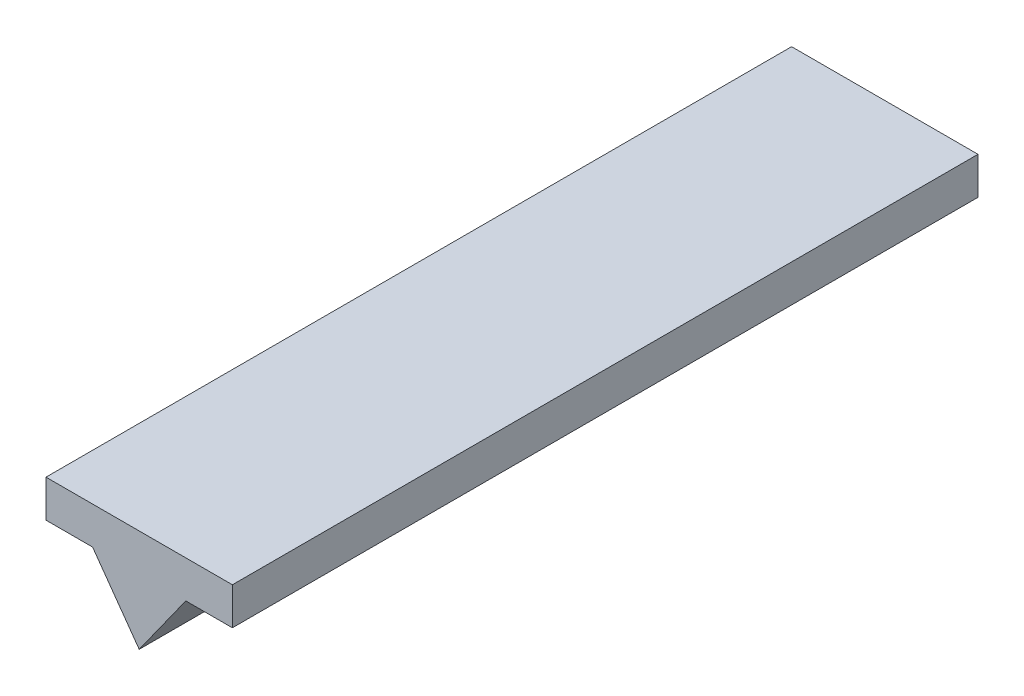
ISO-10303-21;
HEADER;
FILE_DESCRIPTION(('STEP AP214'),'2;1');
FILE_NAME('part.step','',(''),(''),'','','');
FILE_SCHEMA(('AUTOMOTIVE_DESIGN { 1 0 10303 214 1 1 1 1 }'));
ENDSEC;
DATA;
#1=APPLICATION_CONTEXT('core data for automotive mechanical design processes');
#2=APPLICATION_PROTOCOL_DEFINITION('international standard','automotive_design',2000,#1);
#3=PRODUCT_CONTEXT('',#1,'mechanical');
#4=PRODUCT('Part','Part','',(#3));
#5=PRODUCT_RELATED_PRODUCT_CATEGORY('part','',(#4));
#6=PRODUCT_DEFINITION_FORMATION('','',#4);
#7=PRODUCT_DEFINITION_CONTEXT('part definition',#1,'design');
#8=PRODUCT_DEFINITION('design','',#6,#7);
#9=PRODUCT_DEFINITION_SHAPE('','',#8);
#10=(LENGTH_UNIT() NAMED_UNIT(*) SI_UNIT(.MILLI.,.METRE.));
#11=(NAMED_UNIT(*) PLANE_ANGLE_UNIT() SI_UNIT($,.RADIAN.));
#12=(NAMED_UNIT(*) SI_UNIT($,.STERADIAN.) SOLID_ANGLE_UNIT());
#13=UNCERTAINTY_MEASURE_WITH_UNIT(LENGTH_MEASURE(1.E-05),#10,'distance_accuracy_value','');
#14=(GEOMETRIC_REPRESENTATION_CONTEXT(3) GLOBAL_UNCERTAINTY_ASSIGNED_CONTEXT((#13)) GLOBAL_UNIT_ASSIGNED_CONTEXT((#10,
#11,#12)) REPRESENTATION_CONTEXT('',''));
#15=CARTESIAN_POINT('',(0.,0.,0.));
#16=DIRECTION('',(0.,0.,1.));
#17=DIRECTION('',(1.,0.,0.));
#18=AXIS2_PLACEMENT_3D('',#15,#16,#17);
#19=CARTESIAN_POINT('',(0.,-0.4,8.));
#20=DIRECTION('',(1.,0.,0.));
#21=DIRECTION('',(0.,1.,0.));
#22=AXIS2_PLACEMENT_3D('',#19,#20,#21);
#23=PLANE('',#22);
#24=DIRECTION('',(0.,-1.,0.));
#25=VECTOR('',#24,1.);
#26=CARTESIAN_POINT('',(0.,-0.4,0.));
#27=LINE('',#26,#25);
#28=CARTESIAN_POINT('',(0.,0.,0.));
#29=VERTEX_POINT('',#28);
#30=CARTESIAN_POINT('',(0.,-0.4,0.));
#31=VERTEX_POINT('',#30);
#32=EDGE_CURVE('E134',#29,#31,#27,.T.);
#33=ORIENTED_EDGE('',*,*,#32,.T.);
#34=DIRECTION('',(0.,0.,-1.));
#35=VECTOR('',#34,1.);
#36=CARTESIAN_POINT('',(0.,-0.4,8.));
#37=LINE('',#36,#35);
#38=CARTESIAN_POINT('',(0.,-0.4,8.));
#39=VERTEX_POINT('',#38);
#40=EDGE_CURVE('E11',#39,#31,#37,.T.);
#41=ORIENTED_EDGE('',*,*,#40,.F.);
#42=DIRECTION('',(0.,-1.,0.));
#43=VECTOR('',#42,1.);
#44=CARTESIAN_POINT('',(0.,-0.4,8.));
#45=LINE('',#44,#43);
#46=CARTESIAN_POINT('',(0.,0.,8.));
#47=VERTEX_POINT('',#46);
#48=EDGE_CURVE('E153',#47,#39,#45,.T.);
#49=ORIENTED_EDGE('',*,*,#48,.F.);
#50=DIRECTION('',(0.,0.,-1.));
#51=VECTOR('',#50,1.);
#52=CARTESIAN_POINT('',(0.,0.,8.));
#53=LINE('',#52,#51);
#54=EDGE_CURVE('E130',#47,#29,#53,.T.);
#55=ORIENTED_EDGE('',*,*,#54,.T.);
#56=EDGE_LOOP('',(#33,#41,#49,#55));
#57=FACE_BOUND('',#56,.T.);
#58=ADVANCED_FACE('F39',(#57),#23,.F.);
#59=CARTESIAN_POINT('',(0.5,-0.4,8.));
#60=DIRECTION('',(0.,1.,0.));
#61=DIRECTION('',(0.,0.,1.));
#62=AXIS2_PLACEMENT_3D('',#59,#60,#61);
#63=PLANE('',#62);
#64=DIRECTION('',(1.,0.,0.));
#65=VECTOR('',#64,1.);
#66=CARTESIAN_POINT('',(0.5,-0.4,0.));
#67=LINE('',#66,#65);
#68=CARTESIAN_POINT('',(0.5,-0.4,0.));
#69=VERTEX_POINT('',#68);
#70=EDGE_CURVE('E138',#31,#69,#67,.T.);
#71=ORIENTED_EDGE('',*,*,#70,.T.);
#72=DIRECTION('',(0.,0.,-1.));
#73=VECTOR('',#72,1.);
#74=CARTESIAN_POINT('',(0.5,-0.4,8.));
#75=LINE('',#74,#73);
#76=CARTESIAN_POINT('',(0.5,-0.4,8.));
#77=VERTEX_POINT('',#76);
#78=EDGE_CURVE('E48',#77,#69,#75,.T.);
#79=ORIENTED_EDGE('',*,*,#78,.F.);
#80=DIRECTION('',(1.,0.,0.));
#81=VECTOR('',#80,1.);
#82=CARTESIAN_POINT('',(0.5,-0.4,8.));
#83=LINE('',#82,#81);
#84=EDGE_CURVE('E96',#39,#77,#83,.T.);
#85=ORIENTED_EDGE('',*,*,#84,.F.);
#86=ORIENTED_EDGE('',*,*,#40,.T.);
#87=EDGE_LOOP('',(#71,#79,#85,#86));
#88=FACE_BOUND('',#87,.T.);
#89=ADVANCED_FACE('F187',(#88),#63,.F.);
#90=CARTESIAN_POINT('',(1.,-1.1,8.));
#91=DIRECTION('',(0.813733471206735,0.581238193719096,0.));
#92=DIRECTION('',(-0.581238193719096,0.813733471206735,0.));
#93=AXIS2_PLACEMENT_3D('',#90,#91,#92);
#94=PLANE('',#93);
#95=DIRECTION('',(0.581238193719096,-0.813733471206735,0.));
#96=VECTOR('',#95,1.);
#97=CARTESIAN_POINT('',(1.,-1.1,0.));
#98=LINE('',#97,#96);
#99=CARTESIAN_POINT('',(1.,-1.1,0.));
#100=VERTEX_POINT('',#99);
#101=EDGE_CURVE('E141',#69,#100,#98,.T.);
#102=ORIENTED_EDGE('',*,*,#101,.T.);
#103=DIRECTION('',(0.,0.,-1.));
#104=VECTOR('',#103,1.);
#105=CARTESIAN_POINT('',(1.,-1.1,8.));
#106=LINE('',#105,#104);
#107=CARTESIAN_POINT('',(1.,-1.1,8.));
#108=VERTEX_POINT('',#107);
#109=EDGE_CURVE('E160',#108,#100,#106,.T.);
#110=ORIENTED_EDGE('',*,*,#109,.F.);
#111=DIRECTION('',(0.581238193719096,-0.813733471206735,0.));
#112=VECTOR('',#111,1.);
#113=CARTESIAN_POINT('',(1.,-1.1,8.));
#114=LINE('',#113,#112);
#115=EDGE_CURVE('E170',#77,#108,#114,.T.);
#116=ORIENTED_EDGE('',*,*,#115,.F.);
#117=ORIENTED_EDGE('',*,*,#78,.T.);
#118=EDGE_LOOP('',(#102,#110,#116,#117));
#119=FACE_BOUND('',#118,.T.);
#120=ADVANCED_FACE('F168',(#119),#94,.F.);
#121=CARTESIAN_POINT('',(1.5,-0.4,8.));
#122=DIRECTION('',(-0.813733471206735,0.581238193719096,0.));
#123=DIRECTION('',(-0.581238193719096,-0.813733471206735,0.));
#124=AXIS2_PLACEMENT_3D('',#121,#122,#123);
#125=PLANE('',#124);
#126=DIRECTION('',(0.581238193719096,0.813733471206735,0.));
#127=VECTOR('',#126,1.);
#128=CARTESIAN_POINT('',(1.5,-0.4,0.));
#129=LINE('',#128,#127);
#130=CARTESIAN_POINT('',(1.5,-0.4,0.));
#131=VERTEX_POINT('',#130);
#132=EDGE_CURVE('E144',#100,#131,#129,.T.);
#133=ORIENTED_EDGE('',*,*,#132,.T.);
#134=DIRECTION('',(0.,0.,-1.));
#135=VECTOR('',#134,1.);
#136=CARTESIAN_POINT('',(1.5,-0.4,8.));
#137=LINE('',#136,#135);
#138=CARTESIAN_POINT('',(1.5,-0.4,8.));
#139=VERTEX_POINT('',#138);
#140=EDGE_CURVE('E123',#139,#131,#137,.T.);
#141=ORIENTED_EDGE('',*,*,#140,.F.);
#142=DIRECTION('',(0.581238193719096,0.813733471206735,0.));
#143=VECTOR('',#142,1.);
#144=CARTESIAN_POINT('',(1.5,-0.4,8.));
#145=LINE('',#144,#143);
#146=EDGE_CURVE('E112',#108,#139,#145,.T.);
#147=ORIENTED_EDGE('',*,*,#146,.F.);
#148=ORIENTED_EDGE('',*,*,#109,.T.);
#149=EDGE_LOOP('',(#133,#141,#147,#148));
#150=FACE_BOUND('',#149,.T.);
#151=ADVANCED_FACE('F176',(#150),#125,.F.);
#152=CARTESIAN_POINT('',(2.,-0.4,8.));
#153=DIRECTION('',(0.,1.,0.));
#154=DIRECTION('',(0.,0.,1.));
#155=AXIS2_PLACEMENT_3D('',#152,#153,#154);
#156=PLANE('',#155);
#157=DIRECTION('',(1.,0.,0.));
#158=VECTOR('',#157,1.);
#159=CARTESIAN_POINT('',(2.,-0.4,0.));
#160=LINE('',#159,#158);
#161=CARTESIAN_POINT('',(2.,-0.4,0.));
#162=VERTEX_POINT('',#161);
#163=EDGE_CURVE('E121',#131,#162,#160,.T.);
#164=ORIENTED_EDGE('',*,*,#163,.T.);
#165=DIRECTION('',(0.,0.,-1.));
#166=VECTOR('',#165,1.);
#167=CARTESIAN_POINT('',(2.,-0.4,8.));
#168=LINE('',#167,#166);
#169=CARTESIAN_POINT('',(2.,-0.4,8.));
#170=VERTEX_POINT('',#169);
#171=EDGE_CURVE('E118',#170,#162,#168,.T.);
#172=ORIENTED_EDGE('',*,*,#171,.F.);
#173=DIRECTION('',(1.,0.,0.));
#174=VECTOR('',#173,1.);
#175=CARTESIAN_POINT('',(2.,-0.4,8.));
#176=LINE('',#175,#174);
#177=EDGE_CURVE('E106',#139,#170,#176,.T.);
#178=ORIENTED_EDGE('',*,*,#177,.F.);
#179=ORIENTED_EDGE('',*,*,#140,.T.);
#180=EDGE_LOOP('',(#164,#172,#178,#179));
#181=FACE_BOUND('',#180,.T.);
#182=ADVANCED_FACE('F119',(#181),#156,.F.);
#183=CARTESIAN_POINT('',(2.,0.,8.));
#184=DIRECTION('',(-1.,0.,0.));
#185=DIRECTION('',(0.,0.,1.));
#186=AXIS2_PLACEMENT_3D('',#183,#184,#185);
#187=PLANE('',#186);
#188=DIRECTION('',(0.,1.,0.));
#189=VECTOR('',#188,1.);
#190=CARTESIAN_POINT('',(2.,0.,0.));
#191=LINE('',#190,#189);
#192=CARTESIAN_POINT('',(2.,0.,0.));
#193=VERTEX_POINT('',#192);
#194=EDGE_CURVE('E82',#162,#193,#191,.T.);
#195=ORIENTED_EDGE('',*,*,#194,.T.);
#196=DIRECTION('',(0.,0.,-1.));
#197=VECTOR('',#196,1.);
#198=CARTESIAN_POINT('',(2.,0.,8.));
#199=LINE('',#198,#197);
#200=CARTESIAN_POINT('',(2.,0.,8.));
#201=VERTEX_POINT('',#200);
#202=EDGE_CURVE('E124',#201,#193,#199,.T.);
#203=ORIENTED_EDGE('',*,*,#202,.F.);
#204=DIRECTION('',(0.,1.,0.));
#205=VECTOR('',#204,1.);
#206=CARTESIAN_POINT('',(2.,0.,8.));
#207=LINE('',#206,#205);
#208=EDGE_CURVE('E110',#170,#201,#207,.T.);
#209=ORIENTED_EDGE('',*,*,#208,.F.);
#210=ORIENTED_EDGE('',*,*,#171,.T.);
#211=EDGE_LOOP('',(#195,#203,#209,#210));
#212=FACE_BOUND('',#211,.T.);
#213=ADVANCED_FACE('F126',(#212),#187,.F.);
#214=CARTESIAN_POINT('',(0.,0.,8.));
#215=DIRECTION('',(0.,-1.,0.));
#216=DIRECTION('',(0.,0.,-1.));
#217=AXIS2_PLACEMENT_3D('',#214,#215,#216);
#218=PLANE('',#217);
#219=DIRECTION('',(-1.,0.,0.));
#220=VECTOR('',#219,1.);
#221=CARTESIAN_POINT('',(0.,0.,0.));
#222=LINE('',#221,#220);
#223=EDGE_CURVE('E88',#193,#29,#222,.T.);
#224=ORIENTED_EDGE('',*,*,#223,.T.);
#225=ORIENTED_EDGE('',*,*,#54,.F.);
#226=DIRECTION('',(-1.,0.,0.));
#227=VECTOR('',#226,1.);
#228=CARTESIAN_POINT('',(0.,0.,8.));
#229=LINE('',#228,#227);
#230=EDGE_CURVE('E56',#201,#47,#229,.T.);
#231=ORIENTED_EDGE('',*,*,#230,.F.);
#232=ORIENTED_EDGE('',*,*,#202,.T.);
#233=EDGE_LOOP('',(#224,#225,#231,#232));
#234=FACE_BOUND('',#233,.T.);
#235=ADVANCED_FACE('F201',(#234),#218,.F.);
#236=CARTESIAN_POINT('',(0.,0.,8.));
#237=DIRECTION('',(0.,0.,-1.));
#238=DIRECTION('',(-1.,0.,0.));
#239=AXIS2_PLACEMENT_3D('',#236,#237,#238);
#240=PLANE('',#239);
#241=ORIENTED_EDGE('',*,*,#48,.T.);
#242=ORIENTED_EDGE('',*,*,#84,.T.);
#243=ORIENTED_EDGE('',*,*,#115,.T.);
#244=ORIENTED_EDGE('',*,*,#146,.T.);
#245=ORIENTED_EDGE('',*,*,#177,.T.);
#246=ORIENTED_EDGE('',*,*,#208,.T.);
#247=ORIENTED_EDGE('',*,*,#230,.T.);
#248=EDGE_LOOP('',(#241,#242,#243,#244,#245,#246,#247));
#249=FACE_BOUND('',#248,.T.);
#250=ADVANCED_FACE('F108',(#249),#240,.F.);
#251=CARTESIAN_POINT('',(0.,0.,0.));
#252=DIRECTION('',(0.,0.,-1.));
#253=DIRECTION('',(-1.,0.,0.));
#254=AXIS2_PLACEMENT_3D('',#251,#252,#253);
#255=PLANE('',#254);
#256=ORIENTED_EDGE('',*,*,#32,.F.);
#257=ORIENTED_EDGE('',*,*,#223,.F.);
#258=ORIENTED_EDGE('',*,*,#194,.F.);
#259=ORIENTED_EDGE('',*,*,#163,.F.);
#260=ORIENTED_EDGE('',*,*,#132,.F.);
#261=ORIENTED_EDGE('',*,*,#101,.F.);
#262=ORIENTED_EDGE('',*,*,#70,.F.);
#263=EDGE_LOOP('',(#256,#257,#258,#259,#260,#261,#262));
#264=FACE_BOUND('',#263,.T.);
#265=ADVANCED_FACE('F174',(#264),#255,.T.);
#266=CLOSED_SHELL('',(#58,#89,#120,#151,#182,#213,#235,#250,#265));
#267=MANIFOLD_SOLID_BREP('B2',#266);
#268=ADVANCED_BREP_SHAPE_REPRESENTATION('',(#18,#267),#14);
#269=SHAPE_DEFINITION_REPRESENTATION(#9,#268);
ENDSEC;
END-ISO-10303-21;
